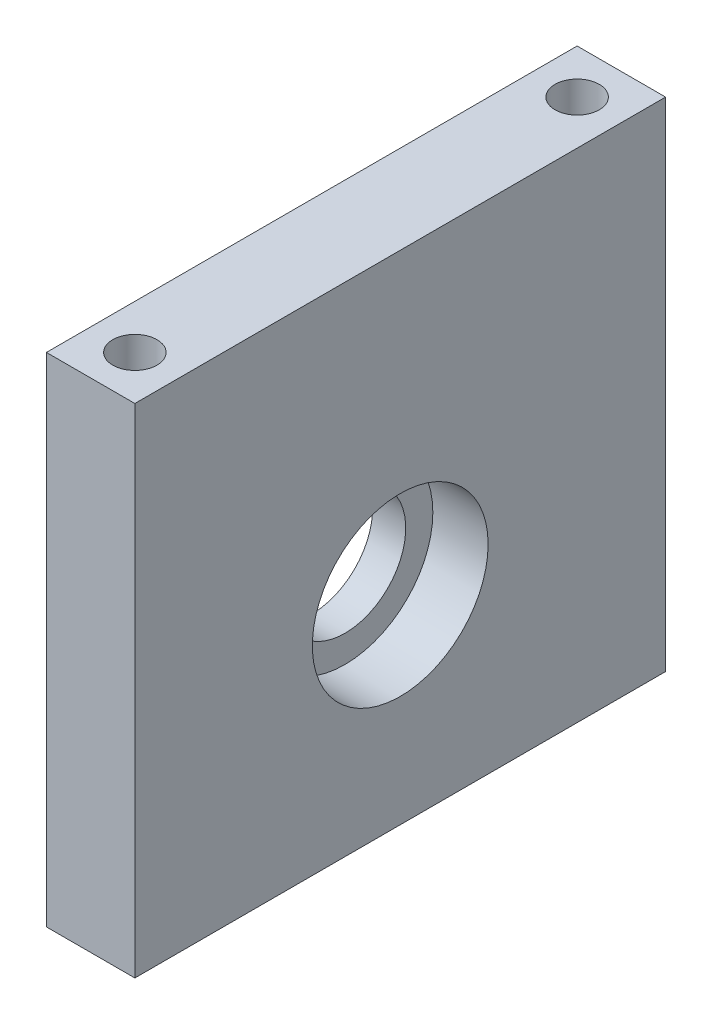
ISO-10303-21;
HEADER;
FILE_DESCRIPTION(('STEP AP214'),'2;1');
FILE_NAME('part.step','',(''),(''),'','','');
FILE_SCHEMA(('AUTOMOTIVE_DESIGN { 1 0 10303 214 1 1 1 1 }'));
ENDSEC;
DATA;
#1=APPLICATION_CONTEXT('core data for automotive mechanical design processes');
#2=APPLICATION_PROTOCOL_DEFINITION('international standard','automotive_design',2000,#1);
#3=PRODUCT_CONTEXT('',#1,'mechanical');
#4=PRODUCT('Part','Part','',(#3));
#5=PRODUCT_RELATED_PRODUCT_CATEGORY('part','',(#4));
#6=PRODUCT_DEFINITION_FORMATION('','',#4);
#7=PRODUCT_DEFINITION_CONTEXT('part definition',#1,'design');
#8=PRODUCT_DEFINITION('design','',#6,#7);
#9=PRODUCT_DEFINITION_SHAPE('','',#8);
#10=(LENGTH_UNIT() NAMED_UNIT(*) SI_UNIT(.MILLI.,.METRE.));
#11=(NAMED_UNIT(*) PLANE_ANGLE_UNIT() SI_UNIT($,.RADIAN.));
#12=(NAMED_UNIT(*) SI_UNIT($,.STERADIAN.) SOLID_ANGLE_UNIT());
#13=UNCERTAINTY_MEASURE_WITH_UNIT(LENGTH_MEASURE(1.E-05),#10,'distance_accuracy_value','');
#14=(GEOMETRIC_REPRESENTATION_CONTEXT(3) GLOBAL_UNCERTAINTY_ASSIGNED_CONTEXT((#13)) GLOBAL_UNIT_ASSIGNED_CONTEXT((#10,
#11,#12)) REPRESENTATION_CONTEXT('',''));
#15=CARTESIAN_POINT('',(0.,0.,0.));
#16=DIRECTION('',(0.,0.,1.));
#17=DIRECTION('',(1.,0.,0.));
#18=AXIS2_PLACEMENT_3D('',#15,#16,#17);
#19=CARTESIAN_POINT('',(-2.,18.,-24.));
#20=DIRECTION('',(1.,0.,0.));
#21=DIRECTION('',(0.,0.,-1.));
#22=AXIS2_PLACEMENT_3D('',#19,#20,#21);
#23=CYLINDRICAL_SURFACE('',#22,7.95);
#24=CARTESIAN_POINT('',(8.,18.,-24.));
#25=DIRECTION('',(1.,0.,0.));
#26=DIRECTION('',(0.,0.,-1.));
#27=AXIS2_PLACEMENT_3D('',#24,#25,#26);
#28=CIRCLE('',#27,7.95);
#29=CARTESIAN_POINT('',(8.,18.,-31.95));
#30=VERTEX_POINT('',#29);
#31=EDGE_CURVE('E112',#30,#30,#28,.T.);
#32=ORIENTED_EDGE('',*,*,#31,.T.);
#33=EDGE_LOOP('',(#32));
#34=FACE_BOUND('',#33,.T.);
#35=CARTESIAN_POINT('',(3.,18.,-24.));
#36=DIRECTION('',(-1.,0.,0.));
#37=DIRECTION('',(0.,0.,1.));
#38=AXIS2_PLACEMENT_3D('',#35,#36,#37);
#39=CIRCLE('',#38,7.95);
#40=CARTESIAN_POINT('',(3.,18.,-16.05));
#41=VERTEX_POINT('',#40);
#42=EDGE_CURVE('E11',#41,#41,#39,.F.);
#43=ORIENTED_EDGE('',*,*,#42,.F.);
#44=EDGE_LOOP('',(#43));
#45=FACE_BOUND('',#44,.T.);
#46=ADVANCED_FACE('F41',(#34,#45),#23,.F.);
#47=CARTESIAN_POINT('',(0.,45.,-48.));
#48=DIRECTION('',(0.,0.,1.));
#49=DIRECTION('',(1.,0.,0.));
#50=AXIS2_PLACEMENT_3D('',#47,#48,#49);
#51=PLANE('',#50);
#52=DIRECTION('',(-1.,0.,0.));
#53=VECTOR('',#52,1.);
#54=CARTESIAN_POINT('',(0.,0.,-48.));
#55=LINE('',#54,#53);
#56=CARTESIAN_POINT('',(8.,0.,-48.));
#57=VERTEX_POINT('',#56);
#58=CARTESIAN_POINT('',(0.,0.,-48.));
#59=VERTEX_POINT('',#58);
#60=EDGE_CURVE('E109',#57,#59,#55,.T.);
#61=ORIENTED_EDGE('',*,*,#60,.T.);
#62=DIRECTION('',(0.,-1.,0.));
#63=VECTOR('',#62,1.);
#64=CARTESIAN_POINT('',(0.,45.,-48.));
#65=LINE('',#64,#63);
#66=CARTESIAN_POINT('',(0.,45.,-48.));
#67=VERTEX_POINT('',#66);
#68=EDGE_CURVE('E50',#67,#59,#65,.T.);
#69=ORIENTED_EDGE('',*,*,#68,.F.);
#70=DIRECTION('',(-1.,0.,0.));
#71=VECTOR('',#70,1.);
#72=CARTESIAN_POINT('',(0.,45.,-48.));
#73=LINE('',#72,#71);
#74=CARTESIAN_POINT('',(8.,45.,-48.));
#75=VERTEX_POINT('',#74);
#76=EDGE_CURVE('E94',#75,#67,#73,.T.);
#77=ORIENTED_EDGE('',*,*,#76,.F.);
#78=DIRECTION('',(0.,-1.,0.));
#79=VECTOR('',#78,1.);
#80=CARTESIAN_POINT('',(8.,45.,-48.));
#81=LINE('',#80,#79);
#82=EDGE_CURVE('E105',#75,#57,#81,.T.);
#83=ORIENTED_EDGE('',*,*,#82,.T.);
#84=EDGE_LOOP('',(#61,#69,#77,#83));
#85=FACE_BOUND('',#84,.T.);
#86=ADVANCED_FACE('F43',(#85),#51,.F.);
#87=CARTESIAN_POINT('',(0.,45.,0.));
#88=DIRECTION('',(1.,0.,0.));
#89=DIRECTION('',(0.,0.,-1.));
#90=AXIS2_PLACEMENT_3D('',#87,#88,#89);
#91=PLANE('',#90);
#92=DIRECTION('',(0.,0.,1.));
#93=VECTOR('',#92,1.);
#94=CARTESIAN_POINT('',(0.,0.,0.));
#95=LINE('',#94,#93);
#96=CARTESIAN_POINT('',(0.,0.,0.));
#97=VERTEX_POINT('',#96);
#98=EDGE_CURVE('E100',#59,#97,#95,.T.);
#99=ORIENTED_EDGE('',*,*,#98,.T.);
#100=DIRECTION('',(0.,-1.,0.));
#101=VECTOR('',#100,1.);
#102=CARTESIAN_POINT('',(0.,45.,0.));
#103=LINE('',#102,#101);
#104=CARTESIAN_POINT('',(0.,45.,0.));
#105=VERTEX_POINT('',#104);
#106=EDGE_CURVE('E97',#105,#97,#103,.T.);
#107=ORIENTED_EDGE('',*,*,#106,.F.);
#108=DIRECTION('',(0.,0.,1.));
#109=VECTOR('',#108,1.);
#110=CARTESIAN_POINT('',(0.,45.,0.));
#111=LINE('',#110,#109);
#112=EDGE_CURVE('E89',#67,#105,#111,.T.);
#113=ORIENTED_EDGE('',*,*,#112,.F.);
#114=ORIENTED_EDGE('',*,*,#68,.T.);
#115=EDGE_LOOP('',(#99,#107,#113,#114));
#116=FACE_BOUND('',#115,.T.);
#117=CARTESIAN_POINT('',(0.,18.,-24.));
#118=DIRECTION('',(-1.,0.,0.));
#119=DIRECTION('',(0.,0.,1.));
#120=AXIS2_PLACEMENT_3D('',#117,#118,#119);
#121=CIRCLE('',#120,5.5);
#122=CARTESIAN_POINT('',(0.,18.,-18.5));
#123=VERTEX_POINT('',#122);
#124=EDGE_CURVE('E204',#123,#123,#121,.T.);
#125=ORIENTED_EDGE('',*,*,#124,.F.);
#126=EDGE_LOOP('',(#125));
#127=FACE_BOUND('',#126,.T.);
#128=ADVANCED_FACE('F98',(#116,#127),#91,.F.);
#129=CARTESIAN_POINT('',(0.,45.,0.));
#130=DIRECTION('',(0.,0.,-1.));
#131=DIRECTION('',(-1.,0.,0.));
#132=AXIS2_PLACEMENT_3D('',#129,#130,#131);
#133=PLANE('',#132);
#134=DIRECTION('',(1.,0.,0.));
#135=VECTOR('',#134,1.);
#136=CARTESIAN_POINT('',(0.,0.,0.));
#137=LINE('',#136,#135);
#138=CARTESIAN_POINT('',(8.,0.,0.));
#139=VERTEX_POINT('',#138);
#140=EDGE_CURVE('E75',#97,#139,#137,.T.);
#141=ORIENTED_EDGE('',*,*,#140,.T.);
#142=DIRECTION('',(0.,-1.,0.));
#143=VECTOR('',#142,1.);
#144=CARTESIAN_POINT('',(8.,45.,0.));
#145=LINE('',#144,#143);
#146=CARTESIAN_POINT('',(8.,45.,0.));
#147=VERTEX_POINT('',#146);
#148=EDGE_CURVE('E101',#147,#139,#145,.T.);
#149=ORIENTED_EDGE('',*,*,#148,.F.);
#150=DIRECTION('',(1.,0.,0.));
#151=VECTOR('',#150,1.);
#152=CARTESIAN_POINT('',(0.,45.,0.));
#153=LINE('',#152,#151);
#154=EDGE_CURVE('E92',#105,#147,#153,.T.);
#155=ORIENTED_EDGE('',*,*,#154,.F.);
#156=ORIENTED_EDGE('',*,*,#106,.T.);
#157=EDGE_LOOP('',(#141,#149,#155,#156));
#158=FACE_BOUND('',#157,.T.);
#159=ADVANCED_FACE('F103',(#158),#133,.F.);
#160=CARTESIAN_POINT('',(8.,45.,0.));
#161=DIRECTION('',(-1.,0.,0.));
#162=DIRECTION('',(0.,0.,1.));
#163=AXIS2_PLACEMENT_3D('',#160,#161,#162);
#164=PLANE('',#163);
#165=ORIENTED_EDGE('',*,*,#31,.F.);
#166=EDGE_LOOP('',(#165));
#167=FACE_BOUND('',#166,.T.);
#168=DIRECTION('',(0.,0.,-1.));
#169=VECTOR('',#168,1.);
#170=CARTESIAN_POINT('',(8.,0.,0.));
#171=LINE('',#170,#169);
#172=EDGE_CURVE('E81',#139,#57,#171,.T.);
#173=ORIENTED_EDGE('',*,*,#172,.T.);
#174=ORIENTED_EDGE('',*,*,#82,.F.);
#175=DIRECTION('',(0.,0.,-1.));
#176=VECTOR('',#175,1.);
#177=CARTESIAN_POINT('',(8.,45.,0.));
#178=LINE('',#177,#176);
#179=EDGE_CURVE('E58',#147,#75,#178,.T.);
#180=ORIENTED_EDGE('',*,*,#179,.F.);
#181=ORIENTED_EDGE('',*,*,#148,.T.);
#182=EDGE_LOOP('',(#173,#174,#180,#181));
#183=FACE_BOUND('',#182,.T.);
#184=ADVANCED_FACE('F132',(#167,#183),#164,.F.);
#185=CARTESIAN_POINT('',(0.,45.,0.));
#186=DIRECTION('',(0.,1.,0.));
#187=DIRECTION('',(0.,0.,1.));
#188=AXIS2_PLACEMENT_3D('',#185,#186,#187);
#189=PLANE('',#188);
#190=CARTESIAN_POINT('',(4.,45.,-44.));
#191=DIRECTION('',(0.,1.,0.));
#192=DIRECTION('',(0.,0.,1.));
#193=AXIS2_PLACEMENT_3D('',#190,#191,#192);
#194=CIRCLE('',#193,2.);
#195=CARTESIAN_POINT('',(4.,45.,-42.));
#196=VERTEX_POINT('',#195);
#197=EDGE_CURVE('E187',#196,#196,#194,.T.);
#198=ORIENTED_EDGE('',*,*,#197,.F.);
#199=EDGE_LOOP('',(#198));
#200=FACE_BOUND('',#199,.T.);
#201=CARTESIAN_POINT('',(4.,45.,-4.));
#202=DIRECTION('',(0.,1.,0.));
#203=DIRECTION('',(0.,0.,1.));
#204=AXIS2_PLACEMENT_3D('',#201,#202,#203);
#205=CIRCLE('',#204,2.);
#206=CARTESIAN_POINT('',(4.,45.,-2.));
#207=VERTEX_POINT('',#206);
#208=EDGE_CURVE('E198',#207,#207,#205,.T.);
#209=ORIENTED_EDGE('',*,*,#208,.F.);
#210=EDGE_LOOP('',(#209));
#211=FACE_BOUND('',#210,.T.);
#212=ORIENTED_EDGE('',*,*,#76,.T.);
#213=ORIENTED_EDGE('',*,*,#112,.T.);
#214=ORIENTED_EDGE('',*,*,#154,.T.);
#215=ORIENTED_EDGE('',*,*,#179,.T.);
#216=EDGE_LOOP('',(#212,#213,#214,#215));
#217=FACE_BOUND('',#216,.T.);
#218=ADVANCED_FACE('F90',(#200,#211,#217),#189,.T.);
#219=CARTESIAN_POINT('',(0.,0.,0.));
#220=DIRECTION('',(0.,1.,0.));
#221=DIRECTION('',(0.,0.,1.));
#222=AXIS2_PLACEMENT_3D('',#219,#220,#221);
#223=PLANE('',#222);
#224=CARTESIAN_POINT('',(4.,0.,-44.));
#225=DIRECTION('',(0.,-1.,0.));
#226=DIRECTION('',(0.,0.,-1.));
#227=AXIS2_PLACEMENT_3D('',#224,#225,#226);
#228=CIRCLE('',#227,2.);
#229=CARTESIAN_POINT('',(4.,0.,-46.));
#230=VERTEX_POINT('',#229);
#231=EDGE_CURVE('E205',#230,#230,#228,.T.);
#232=ORIENTED_EDGE('',*,*,#231,.F.);
#233=EDGE_LOOP('',(#232));
#234=FACE_BOUND('',#233,.T.);
#235=CARTESIAN_POINT('',(4.,0.,-4.));
#236=DIRECTION('',(0.,-1.,0.));
#237=DIRECTION('',(0.,0.,-1.));
#238=AXIS2_PLACEMENT_3D('',#235,#236,#237);
#239=CIRCLE('',#238,2.);
#240=CARTESIAN_POINT('',(4.,0.,-6.));
#241=VERTEX_POINT('',#240);
#242=EDGE_CURVE('E186',#241,#241,#239,.T.);
#243=ORIENTED_EDGE('',*,*,#242,.F.);
#244=EDGE_LOOP('',(#243));
#245=FACE_BOUND('',#244,.T.);
#246=ORIENTED_EDGE('',*,*,#60,.F.);
#247=ORIENTED_EDGE('',*,*,#172,.F.);
#248=ORIENTED_EDGE('',*,*,#140,.F.);
#249=ORIENTED_EDGE('',*,*,#98,.F.);
#250=EDGE_LOOP('',(#246,#247,#248,#249));
#251=FACE_BOUND('',#250,.T.);
#252=ADVANCED_FACE('F120',(#234,#245,#251),#223,.F.);
#253=CARTESIAN_POINT('',(3.,18.,-24.));
#254=DIRECTION('',(-1.,0.,0.));
#255=DIRECTION('',(0.,0.,1.));
#256=AXIS2_PLACEMENT_3D('',#253,#254,#255);
#257=PLANE('',#256);
#258=CARTESIAN_POINT('',(3.,18.,-24.));
#259=DIRECTION('',(-1.,0.,0.));
#260=DIRECTION('',(0.,0.,1.));
#261=AXIS2_PLACEMENT_3D('',#258,#259,#260);
#262=CIRCLE('',#261,5.5);
#263=CARTESIAN_POINT('',(3.,18.,-18.5));
#264=VERTEX_POINT('',#263);
#265=EDGE_CURVE('E210',#264,#264,#262,.T.);
#266=ORIENTED_EDGE('',*,*,#265,.T.);
#267=EDGE_LOOP('',(#266));
#268=FACE_BOUND('',#267,.T.);
#269=ORIENTED_EDGE('',*,*,#42,.T.);
#270=EDGE_LOOP('',(#269));
#271=FACE_BOUND('',#270,.T.);
#272=ADVANCED_FACE('F122',(#268,#271),#257,.F.);
#273=CARTESIAN_POINT('',(3.,18.,-24.));
#274=DIRECTION('',(-1.,0.,0.));
#275=DIRECTION('',(0.,0.,1.));
#276=AXIS2_PLACEMENT_3D('',#273,#274,#275);
#277=CYLINDRICAL_SURFACE('',#276,5.5);
#278=ORIENTED_EDGE('',*,*,#265,.F.);
#279=EDGE_LOOP('',(#278));
#280=FACE_BOUND('',#279,.T.);
#281=ORIENTED_EDGE('',*,*,#124,.T.);
#282=EDGE_LOOP('',(#281));
#283=FACE_BOUND('',#282,.T.);
#284=ADVANCED_FACE('F129',(#280,#283),#277,.F.);
#285=CARTESIAN_POINT('',(4.,15.,-4.));
#286=DIRECTION('',(0.,-1.,0.));
#287=DIRECTION('',(0.,0.,-1.));
#288=AXIS2_PLACEMENT_3D('',#285,#286,#287);
#289=CYLINDRICAL_SURFACE('',#288,2.);
#290=CARTESIAN_POINT('',(4.,15.,-4.));
#291=DIRECTION('',(0.,-1.,0.));
#292=DIRECTION('',(0.,0.,-1.));
#293=AXIS2_PLACEMENT_3D('',#290,#291,#292);
#294=CIRCLE('',#293,2.);
#295=CARTESIAN_POINT('',(4.,15.,-6.));
#296=VERTEX_POINT('',#295);
#297=EDGE_CURVE('E190',#296,#296,#294,.T.);
#298=ORIENTED_EDGE('',*,*,#297,.F.);
#299=EDGE_LOOP('',(#298));
#300=FACE_BOUND('',#299,.T.);
#301=ORIENTED_EDGE('',*,*,#242,.T.);
#302=EDGE_LOOP('',(#301));
#303=FACE_BOUND('',#302,.T.);
#304=ADVANCED_FACE('F149',(#300,#303),#289,.F.);
#305=CARTESIAN_POINT('',(4.,15.,-4.));
#306=DIRECTION('',(0.,-1.,0.));
#307=DIRECTION('',(0.,0.,-1.));
#308=AXIS2_PLACEMENT_3D('',#305,#306,#307);
#309=PLANE('',#308);
#310=ORIENTED_EDGE('',*,*,#297,.T.);
#311=EDGE_LOOP('',(#310));
#312=FACE_BOUND('',#311,.T.);
#313=ADVANCED_FACE('F153',(#312),#309,.T.);
#314=CARTESIAN_POINT('',(4.,15.,-44.));
#315=DIRECTION('',(0.,-1.,0.));
#316=DIRECTION('',(0.,0.,-1.));
#317=AXIS2_PLACEMENT_3D('',#314,#315,#316);
#318=CYLINDRICAL_SURFACE('',#317,2.);
#319=CARTESIAN_POINT('',(4.,15.,-44.));
#320=DIRECTION('',(0.,-1.,0.));
#321=DIRECTION('',(0.,0.,-1.));
#322=AXIS2_PLACEMENT_3D('',#319,#320,#321);
#323=CIRCLE('',#322,2.);
#324=CARTESIAN_POINT('',(4.,15.,-46.));
#325=VERTEX_POINT('',#324);
#326=EDGE_CURVE('E201',#325,#325,#323,.T.);
#327=ORIENTED_EDGE('',*,*,#326,.F.);
#328=EDGE_LOOP('',(#327));
#329=FACE_BOUND('',#328,.T.);
#330=ORIENTED_EDGE('',*,*,#231,.T.);
#331=EDGE_LOOP('',(#330));
#332=FACE_BOUND('',#331,.T.);
#333=ADVANCED_FACE('F157',(#329,#332),#318,.F.);
#334=CARTESIAN_POINT('',(4.,15.,-44.));
#335=DIRECTION('',(0.,-1.,0.));
#336=DIRECTION('',(0.,0.,-1.));
#337=AXIS2_PLACEMENT_3D('',#334,#335,#336);
#338=PLANE('',#337);
#339=ORIENTED_EDGE('',*,*,#326,.T.);
#340=EDGE_LOOP('',(#339));
#341=FACE_BOUND('',#340,.T.);
#342=ADVANCED_FACE('F161',(#341),#338,.T.);
#343=CARTESIAN_POINT('',(4.,30.,-4.));
#344=DIRECTION('',(0.,1.,0.));
#345=DIRECTION('',(0.,0.,1.));
#346=AXIS2_PLACEMENT_3D('',#343,#344,#345);
#347=CYLINDRICAL_SURFACE('',#346,2.);
#348=CARTESIAN_POINT('',(4.,30.,-4.));
#349=DIRECTION('',(0.,1.,0.));
#350=DIRECTION('',(0.,0.,1.));
#351=AXIS2_PLACEMENT_3D('',#348,#349,#350);
#352=CIRCLE('',#351,2.);
#353=CARTESIAN_POINT('',(4.,30.,-2.));
#354=VERTEX_POINT('',#353);
#355=EDGE_CURVE('E193',#354,#354,#352,.T.);
#356=ORIENTED_EDGE('',*,*,#355,.F.);
#357=EDGE_LOOP('',(#356));
#358=FACE_BOUND('',#357,.T.);
#359=ORIENTED_EDGE('',*,*,#208,.T.);
#360=EDGE_LOOP('',(#359));
#361=FACE_BOUND('',#360,.T.);
#362=ADVANCED_FACE('F165',(#358,#361),#347,.F.);
#363=CARTESIAN_POINT('',(4.,30.,-4.));
#364=DIRECTION('',(0.,1.,0.));
#365=DIRECTION('',(0.,0.,1.));
#366=AXIS2_PLACEMENT_3D('',#363,#364,#365);
#367=PLANE('',#366);
#368=ORIENTED_EDGE('',*,*,#355,.T.);
#369=EDGE_LOOP('',(#368));
#370=FACE_BOUND('',#369,.T.);
#371=ADVANCED_FACE('F169',(#370),#367,.T.);
#372=CARTESIAN_POINT('',(4.,30.,-44.));
#373=DIRECTION('',(0.,1.,0.));
#374=DIRECTION('',(0.,0.,1.));
#375=AXIS2_PLACEMENT_3D('',#372,#373,#374);
#376=CYLINDRICAL_SURFACE('',#375,2.);
#377=CARTESIAN_POINT('',(4.,30.,-44.));
#378=DIRECTION('',(0.,1.,0.));
#379=DIRECTION('',(0.,0.,1.));
#380=AXIS2_PLACEMENT_3D('',#377,#378,#379);
#381=CIRCLE('',#380,2.);
#382=CARTESIAN_POINT('',(4.,30.,-42.));
#383=VERTEX_POINT('',#382);
#384=EDGE_CURVE('E185',#383,#383,#381,.T.);
#385=ORIENTED_EDGE('',*,*,#384,.F.);
#386=EDGE_LOOP('',(#385));
#387=FACE_BOUND('',#386,.T.);
#388=ORIENTED_EDGE('',*,*,#197,.T.);
#389=EDGE_LOOP('',(#388));
#390=FACE_BOUND('',#389,.T.);
#391=ADVANCED_FACE('F173',(#387,#390),#376,.F.);
#392=CARTESIAN_POINT('',(4.,30.,-44.));
#393=DIRECTION('',(0.,1.,0.));
#394=DIRECTION('',(0.,0.,1.));
#395=AXIS2_PLACEMENT_3D('',#392,#393,#394);
#396=PLANE('',#395);
#397=ORIENTED_EDGE('',*,*,#384,.T.);
#398=EDGE_LOOP('',(#397));
#399=FACE_BOUND('',#398,.T.);
#400=ADVANCED_FACE('F177',(#399),#396,.T.);
#401=CLOSED_SHELL('',(#46,#86,#128,#159,#184,#218,#252,#272,#284,#304,#313,#333,#342,#362,#371,
#391,#400));
#402=MANIFOLD_SOLID_BREP('B2',#401);
#403=ADVANCED_BREP_SHAPE_REPRESENTATION('',(#18,#402),#14);
#404=SHAPE_DEFINITION_REPRESENTATION(#9,#403);
ENDSEC;
END-ISO-10303-21;
